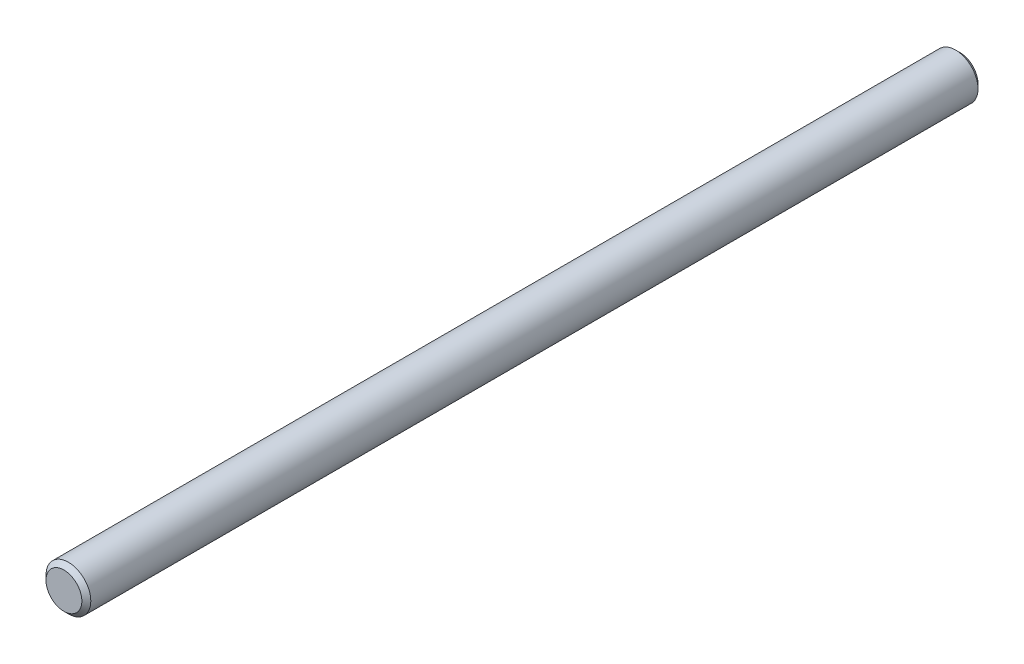
ISO-10303-21;
HEADER;
FILE_DESCRIPTION(('STEP AP214'),'2;1');
FILE_NAME('part.step','',(''),(''),'','','');
FILE_SCHEMA(('AUTOMOTIVE_DESIGN { 1 0 10303 214 1 1 1 1 }'));
ENDSEC;
DATA;
#1=APPLICATION_CONTEXT('core data for automotive mechanical design processes');
#2=APPLICATION_PROTOCOL_DEFINITION('international standard','automotive_design',2000,#1);
#3=PRODUCT_CONTEXT('',#1,'mechanical');
#4=PRODUCT('Part','Part','',(#3));
#5=PRODUCT_RELATED_PRODUCT_CATEGORY('part','',(#4));
#6=PRODUCT_DEFINITION_FORMATION('','',#4);
#7=PRODUCT_DEFINITION_CONTEXT('part definition',#1,'design');
#8=PRODUCT_DEFINITION('design','',#6,#7);
#9=PRODUCT_DEFINITION_SHAPE('','',#8);
#10=(LENGTH_UNIT() NAMED_UNIT(*) SI_UNIT(.MILLI.,.METRE.));
#11=(NAMED_UNIT(*) PLANE_ANGLE_UNIT() SI_UNIT($,.RADIAN.));
#12=(NAMED_UNIT(*) SI_UNIT($,.STERADIAN.) SOLID_ANGLE_UNIT());
#13=UNCERTAINTY_MEASURE_WITH_UNIT(LENGTH_MEASURE(1.E-05),#10,'distance_accuracy_value','');
#14=(GEOMETRIC_REPRESENTATION_CONTEXT(3) GLOBAL_UNCERTAINTY_ASSIGNED_CONTEXT((#13)) GLOBAL_UNIT_ASSIGNED_CONTEXT((#10,
#11,#12)) REPRESENTATION_CONTEXT('',''));
#15=CARTESIAN_POINT('',(0.,0.,0.));
#16=DIRECTION('',(0.,0.,1.));
#17=DIRECTION('',(1.,0.,0.));
#18=AXIS2_PLACEMENT_3D('',#15,#16,#17);
#19=CARTESIAN_POINT('',(0.,0.,63.5));
#20=DIRECTION('',(0.,0.,-1.));
#21=DIRECTION('',(-1.,0.,0.));
#22=AXIS2_PLACEMENT_3D('',#19,#20,#21);
#23=CYLINDRICAL_SURFACE('',#22,3.175);
#24=CARTESIAN_POINT('',(0.,0.,62.865));
#25=DIRECTION('',(0.,0.,1.));
#26=DIRECTION('',(1.,0.,0.));
#27=AXIS2_PLACEMENT_3D('',#24,#25,#26);
#28=CIRCLE('',#27,3.175);
#29=CARTESIAN_POINT('',(3.175,0.,62.865));
#30=VERTEX_POINT('',#29);
#31=EDGE_CURVE('E49',#30,#30,#28,.F.);
#32=ORIENTED_EDGE('',*,*,#31,.T.);
#33=EDGE_LOOP('',(#32));
#34=FACE_BOUND('',#33,.T.);
#35=CARTESIAN_POINT('',(0.,0.,-62.865));
#36=DIRECTION('',(0.,0.,1.));
#37=DIRECTION('',(1.,0.,0.));
#38=AXIS2_PLACEMENT_3D('',#35,#36,#37);
#39=CIRCLE('',#38,3.175);
#40=CARTESIAN_POINT('',(3.175,0.,-62.865));
#41=VERTEX_POINT('',#40);
#42=EDGE_CURVE('E55',#41,#41,#39,.T.);
#43=ORIENTED_EDGE('',*,*,#42,.T.);
#44=EDGE_LOOP('',(#43));
#45=FACE_BOUND('',#44,.T.);
#46=ADVANCED_FACE('F41',(#34,#45),#23,.T.);
#47=CARTESIAN_POINT('',(0.,0.,63.5));
#48=DIRECTION('',(0.,0.,1.));
#49=DIRECTION('',(1.,0.,0.));
#50=AXIS2_PLACEMENT_3D('',#47,#48,#49);
#51=PLANE('',#50);
#52=CARTESIAN_POINT('',(0.,0.,63.5));
#53=DIRECTION('',(0.,0.,1.));
#54=DIRECTION('',(1.,0.,0.));
#55=AXIS2_PLACEMENT_3D('',#52,#53,#54);
#56=CIRCLE('',#55,2.54);
#57=CARTESIAN_POINT('',(2.54,0.,63.5));
#58=VERTEX_POINT('',#57);
#59=EDGE_CURVE('E61',#58,#58,#56,.T.);
#60=ORIENTED_EDGE('',*,*,#59,.T.);
#61=EDGE_LOOP('',(#60));
#62=FACE_BOUND('',#61,.T.);
#63=ADVANCED_FACE('F69',(#62),#51,.T.);
#64=CARTESIAN_POINT('',(0.,0.,-63.5));
#65=DIRECTION('',(0.,0.,1.));
#66=DIRECTION('',(1.,0.,0.));
#67=AXIS2_PLACEMENT_3D('',#64,#65,#66);
#68=PLANE('',#67);
#69=CARTESIAN_POINT('',(0.,0.,-63.5));
#70=DIRECTION('',(0.,0.,1.));
#71=DIRECTION('',(1.,0.,0.));
#72=AXIS2_PLACEMENT_3D('',#69,#70,#71);
#73=CIRCLE('',#72,2.53999999999996);
#74=CARTESIAN_POINT('',(2.53999999999996,0.,-63.5));
#75=VERTEX_POINT('',#74);
#76=EDGE_CURVE('E10',#75,#75,#73,.F.);
#77=ORIENTED_EDGE('',*,*,#76,.T.);
#78=EDGE_LOOP('',(#77));
#79=FACE_BOUND('',#78,.T.);
#80=ADVANCED_FACE('F73',(#79),#68,.F.);
#81=CARTESIAN_POINT('',(0.,0.,63.5));
#82=DIRECTION('',(0.,0.,-1.));
#83=DIRECTION('',(-1.,0.,0.));
#84=AXIS2_PLACEMENT_3D('',#81,#82,#83);
#85=CONICAL_SURFACE('',#84,2.54,0.78539816339745);
#86=ORIENTED_EDGE('',*,*,#31,.F.);
#87=EDGE_LOOP('',(#86));
#88=FACE_BOUND('',#87,.T.);
#89=ORIENTED_EDGE('',*,*,#59,.F.);
#90=EDGE_LOOP('',(#89));
#91=FACE_BOUND('',#90,.T.);
#92=ADVANCED_FACE('F71',(#88,#91),#85,.T.);
#93=CARTESIAN_POINT('',(0.,0.,-62.865));
#94=DIRECTION('',(0.,0.,1.));
#95=DIRECTION('',(1.,0.,0.));
#96=AXIS2_PLACEMENT_3D('',#93,#94,#95);
#97=CONICAL_SURFACE('',#96,3.175,0.785398163397439);
#98=ORIENTED_EDGE('',*,*,#76,.F.);
#99=EDGE_LOOP('',(#98));
#100=FACE_BOUND('',#99,.T.);
#101=ORIENTED_EDGE('',*,*,#42,.F.);
#102=EDGE_LOOP('',(#101));
#103=FACE_BOUND('',#102,.T.);
#104=ADVANCED_FACE('F43',(#100,#103),#97,.T.);
#105=CLOSED_SHELL('',(#46,#63,#80,#92,#104));
#106=MANIFOLD_SOLID_BREP('B2',#105);
#107=ADVANCED_BREP_SHAPE_REPRESENTATION('',(#18,#106),#14);
#108=SHAPE_DEFINITION_REPRESENTATION(#9,#107);
ENDSEC;
END-ISO-10303-21;
